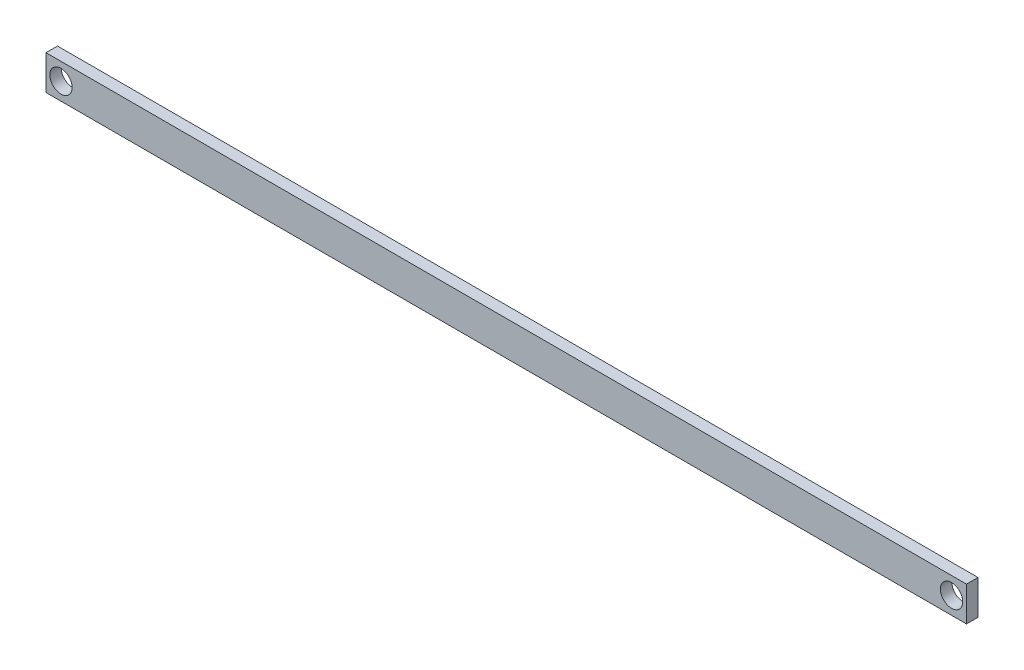
ISO-10303-21;
HEADER;
FILE_DESCRIPTION(('STEP AP214'),'2;1');
FILE_NAME('part.step','',(''),(''),'','','');
FILE_SCHEMA(('AUTOMOTIVE_DESIGN { 1 0 10303 214 1 1 1 1 }'));
ENDSEC;
DATA;
#1=APPLICATION_CONTEXT('core data for automotive mechanical design processes');
#2=APPLICATION_PROTOCOL_DEFINITION('international standard','automotive_design',2000,#1);
#3=PRODUCT_CONTEXT('',#1,'mechanical');
#4=PRODUCT('Part','Part','',(#3));
#5=PRODUCT_RELATED_PRODUCT_CATEGORY('part','',(#4));
#6=PRODUCT_DEFINITION_FORMATION('','',#4);
#7=PRODUCT_DEFINITION_CONTEXT('part definition',#1,'design');
#8=PRODUCT_DEFINITION('design','',#6,#7);
#9=PRODUCT_DEFINITION_SHAPE('','',#8);
#10=(LENGTH_UNIT() NAMED_UNIT(*) SI_UNIT(.MILLI.,.METRE.));
#11=(NAMED_UNIT(*) PLANE_ANGLE_UNIT() SI_UNIT($,.RADIAN.));
#12=(NAMED_UNIT(*) SI_UNIT($,.STERADIAN.) SOLID_ANGLE_UNIT());
#13=UNCERTAINTY_MEASURE_WITH_UNIT(LENGTH_MEASURE(1.E-05),#10,'distance_accuracy_value','');
#14=(GEOMETRIC_REPRESENTATION_CONTEXT(3) GLOBAL_UNCERTAINTY_ASSIGNED_CONTEXT((#13)) GLOBAL_UNIT_ASSIGNED_CONTEXT((#10,
#11,#12)) REPRESENTATION_CONTEXT('',''));
#15=CARTESIAN_POINT('',(0.,0.,0.));
#16=DIRECTION('',(0.,0.,1.));
#17=DIRECTION('',(1.,0.,0.));
#18=AXIS2_PLACEMENT_3D('',#15,#16,#17);
#19=CARTESIAN_POINT('',(0.,0.,-5.));
#20=DIRECTION('',(-1.,0.,0.));
#21=DIRECTION('',(0.,-1.,0.));
#22=AXIS2_PLACEMENT_3D('',#19,#20,#21);
#23=PLANE('',#22);
#24=DIRECTION('',(0.,-1.,0.));
#25=VECTOR('',#24,1.);
#26=CARTESIAN_POINT('',(0.,0.,0.));
#27=LINE('',#26,#25);
#28=CARTESIAN_POINT('',(0.,0.,0.));
#29=VERTEX_POINT('',#28);
#30=CARTESIAN_POINT('',(0.,-15.,0.));
#31=VERTEX_POINT('',#30);
#32=EDGE_CURVE('E117',#29,#31,#27,.T.);
#33=ORIENTED_EDGE('',*,*,#32,.F.);
#34=DIRECTION('',(0.,0.,1.));
#35=VECTOR('',#34,1.);
#36=CARTESIAN_POINT('',(0.,0.,-5.));
#37=LINE('',#36,#35);
#38=CARTESIAN_POINT('',(0.,0.,-5.));
#39=VERTEX_POINT('',#38);
#40=EDGE_CURVE('E11',#39,#29,#37,.T.);
#41=ORIENTED_EDGE('',*,*,#40,.F.);
#42=DIRECTION('',(0.,-1.,0.));
#43=VECTOR('',#42,1.);
#44=CARTESIAN_POINT('',(0.,0.,-5.));
#45=LINE('',#44,#43);
#46=CARTESIAN_POINT('',(0.,-15.,-5.));
#47=VERTEX_POINT('',#46);
#48=EDGE_CURVE('E110',#39,#47,#45,.T.);
#49=ORIENTED_EDGE('',*,*,#48,.T.);
#50=DIRECTION('',(0.,0.,1.));
#51=VECTOR('',#50,1.);
#52=CARTESIAN_POINT('',(0.,-15.,-5.));
#53=LINE('',#52,#51);
#54=EDGE_CURVE('E48',#47,#31,#53,.T.);
#55=ORIENTED_EDGE('',*,*,#54,.T.);
#56=EDGE_LOOP('',(#33,#41,#49,#55));
#57=FACE_BOUND('',#56,.T.);
#58=ADVANCED_FACE('F44',(#57),#23,.T.);
#59=CARTESIAN_POINT('',(0.,0.,-5.));
#60=DIRECTION('',(0.,1.,0.));
#61=DIRECTION('',(0.,0.,1.));
#62=AXIS2_PLACEMENT_3D('',#59,#60,#61);
#63=PLANE('',#62);
#64=DIRECTION('',(-1.,0.,0.));
#65=VECTOR('',#64,1.);
#66=CARTESIAN_POINT('',(0.,0.,0.));
#67=LINE('',#66,#65);
#68=CARTESIAN_POINT('',(400.,0.,0.));
#69=VERTEX_POINT('',#68);
#70=EDGE_CURVE('E106',#69,#29,#67,.T.);
#71=ORIENTED_EDGE('',*,*,#70,.F.);
#72=DIRECTION('',(0.,0.,1.));
#73=VECTOR('',#72,1.);
#74=CARTESIAN_POINT('',(400.,0.,-5.));
#75=LINE('',#74,#73);
#76=CARTESIAN_POINT('',(400.,0.,-5.));
#77=VERTEX_POINT('',#76);
#78=EDGE_CURVE('E54',#77,#69,#75,.T.);
#79=ORIENTED_EDGE('',*,*,#78,.F.);
#80=DIRECTION('',(-1.,0.,0.));
#81=VECTOR('',#80,1.);
#82=CARTESIAN_POINT('',(0.,0.,-5.));
#83=LINE('',#82,#81);
#84=EDGE_CURVE('E105',#77,#39,#83,.T.);
#85=ORIENTED_EDGE('',*,*,#84,.T.);
#86=ORIENTED_EDGE('',*,*,#40,.T.);
#87=EDGE_LOOP('',(#71,#79,#85,#86));
#88=FACE_BOUND('',#87,.T.);
#89=ADVANCED_FACE('F133',(#88),#63,.T.);
#90=CARTESIAN_POINT('',(400.,-15.,-5.));
#91=DIRECTION('',(1.,0.,0.));
#92=DIRECTION('',(0.,0.,-1.));
#93=AXIS2_PLACEMENT_3D('',#90,#91,#92);
#94=PLANE('',#93);
#95=DIRECTION('',(0.,1.,0.));
#96=VECTOR('',#95,1.);
#97=CARTESIAN_POINT('',(400.,-15.,0.));
#98=LINE('',#97,#96);
#99=CARTESIAN_POINT('',(400.,-15.,0.));
#100=VERTEX_POINT('',#99);
#101=EDGE_CURVE('E96',#100,#69,#98,.T.);
#102=ORIENTED_EDGE('',*,*,#101,.F.);
#103=DIRECTION('',(0.,0.,1.));
#104=VECTOR('',#103,1.);
#105=CARTESIAN_POINT('',(400.,-15.,-5.));
#106=LINE('',#105,#104);
#107=CARTESIAN_POINT('',(400.,-15.,-5.));
#108=VERTEX_POINT('',#107);
#109=EDGE_CURVE('E91',#108,#100,#106,.T.);
#110=ORIENTED_EDGE('',*,*,#109,.F.);
#111=DIRECTION('',(0.,1.,0.));
#112=VECTOR('',#111,1.);
#113=CARTESIAN_POINT('',(400.,-15.,-5.));
#114=LINE('',#113,#112);
#115=EDGE_CURVE('E92',#108,#77,#114,.T.);
#116=ORIENTED_EDGE('',*,*,#115,.T.);
#117=ORIENTED_EDGE('',*,*,#78,.T.);
#118=EDGE_LOOP('',(#102,#110,#116,#117));
#119=FACE_BOUND('',#118,.T.);
#120=ADVANCED_FACE('F93',(#119),#94,.T.);
#121=CARTESIAN_POINT('',(0.,-15.,-5.));
#122=DIRECTION('',(0.,-1.,0.));
#123=DIRECTION('',(0.,0.,-1.));
#124=AXIS2_PLACEMENT_3D('',#121,#122,#123);
#125=PLANE('',#124);
#126=DIRECTION('',(1.,0.,0.));
#127=VECTOR('',#126,1.);
#128=CARTESIAN_POINT('',(0.,-15.,0.));
#129=LINE('',#128,#127);
#130=EDGE_CURVE('E116',#31,#100,#129,.T.);
#131=ORIENTED_EDGE('',*,*,#130,.F.);
#132=ORIENTED_EDGE('',*,*,#54,.F.);
#133=DIRECTION('',(1.,0.,0.));
#134=VECTOR('',#133,1.);
#135=CARTESIAN_POINT('',(0.,-15.,-5.));
#136=LINE('',#135,#134);
#137=EDGE_CURVE('E102',#47,#108,#136,.T.);
#138=ORIENTED_EDGE('',*,*,#137,.T.);
#139=ORIENTED_EDGE('',*,*,#109,.T.);
#140=EDGE_LOOP('',(#131,#132,#138,#139));
#141=FACE_BOUND('',#140,.T.);
#142=ADVANCED_FACE('F103',(#141),#125,.T.);
#143=CARTESIAN_POINT('',(0.,0.,-5.));
#144=DIRECTION('',(0.,0.,1.));
#145=DIRECTION('',(1.,0.,0.));
#146=AXIS2_PLACEMENT_3D('',#143,#144,#145);
#147=PLANE('',#146);
#148=CARTESIAN_POINT('',(6.5,-7.5,-5.));
#149=DIRECTION('',(0.,0.,1.));
#150=DIRECTION('',(1.,0.,0.));
#151=AXIS2_PLACEMENT_3D('',#148,#149,#150);
#152=CIRCLE('',#151,4.85);
#153=CARTESIAN_POINT('',(11.35,-7.5,-5.));
#154=VERTEX_POINT('',#153);
#155=EDGE_CURVE('E123',#154,#154,#152,.T.);
#156=ORIENTED_EDGE('',*,*,#155,.T.);
#157=EDGE_LOOP('',(#156));
#158=FACE_BOUND('',#157,.T.);
#159=CARTESIAN_POINT('',(393.5,-7.5,-5.));
#160=DIRECTION('',(0.,0.,1.));
#161=DIRECTION('',(1.,0.,0.));
#162=AXIS2_PLACEMENT_3D('',#159,#160,#161);
#163=CIRCLE('',#162,4.85000000000003);
#164=CARTESIAN_POINT('',(398.35,-7.5,-5.));
#165=VERTEX_POINT('',#164);
#166=EDGE_CURVE('E176',#165,#165,#163,.T.);
#167=ORIENTED_EDGE('',*,*,#166,.T.);
#168=EDGE_LOOP('',(#167));
#169=FACE_BOUND('',#168,.T.);
#170=ORIENTED_EDGE('',*,*,#48,.F.);
#171=ORIENTED_EDGE('',*,*,#84,.F.);
#172=ORIENTED_EDGE('',*,*,#115,.F.);
#173=ORIENTED_EDGE('',*,*,#137,.F.);
#174=EDGE_LOOP('',(#170,#171,#172,#173));
#175=FACE_BOUND('',#174,.T.);
#176=ADVANCED_FACE('F99',(#158,#169,#175),#147,.F.);
#177=CARTESIAN_POINT('',(0.,0.,0.));
#178=DIRECTION('',(0.,0.,1.));
#179=DIRECTION('',(1.,0.,0.));
#180=AXIS2_PLACEMENT_3D('',#177,#178,#179);
#181=PLANE('',#180);
#182=CARTESIAN_POINT('',(6.5,-7.5,0.));
#183=DIRECTION('',(0.,0.,1.));
#184=DIRECTION('',(1.,0.,0.));
#185=AXIS2_PLACEMENT_3D('',#182,#183,#184);
#186=CIRCLE('',#185,4.85);
#187=CARTESIAN_POINT('',(11.35,-7.5,0.));
#188=VERTEX_POINT('',#187);
#189=EDGE_CURVE('E166',#188,#188,#186,.T.);
#190=ORIENTED_EDGE('',*,*,#189,.F.);
#191=EDGE_LOOP('',(#190));
#192=FACE_BOUND('',#191,.T.);
#193=CARTESIAN_POINT('',(393.5,-7.5,0.));
#194=DIRECTION('',(0.,0.,1.));
#195=DIRECTION('',(1.,0.,0.));
#196=AXIS2_PLACEMENT_3D('',#193,#194,#195);
#197=CIRCLE('',#196,4.85000000000003);
#198=CARTESIAN_POINT('',(398.35,-7.5,0.));
#199=VERTEX_POINT('',#198);
#200=EDGE_CURVE('E169',#199,#199,#197,.T.);
#201=ORIENTED_EDGE('',*,*,#200,.F.);
#202=EDGE_LOOP('',(#201));
#203=FACE_BOUND('',#202,.T.);
#204=ORIENTED_EDGE('',*,*,#32,.T.);
#205=ORIENTED_EDGE('',*,*,#130,.T.);
#206=ORIENTED_EDGE('',*,*,#101,.T.);
#207=ORIENTED_EDGE('',*,*,#70,.T.);
#208=EDGE_LOOP('',(#204,#205,#206,#207));
#209=FACE_BOUND('',#208,.T.);
#210=ADVANCED_FACE('F135',(#192,#203,#209),#181,.T.);
#211=CARTESIAN_POINT('',(393.5,-7.5,-5.));
#212=DIRECTION('',(0.,0.,1.));
#213=DIRECTION('',(1.,0.,0.));
#214=AXIS2_PLACEMENT_3D('',#211,#212,#213);
#215=CYLINDRICAL_SURFACE('',#214,4.85000000000003);
#216=ORIENTED_EDGE('',*,*,#166,.F.);
#217=EDGE_LOOP('',(#216));
#218=FACE_BOUND('',#217,.T.);
#219=ORIENTED_EDGE('',*,*,#200,.T.);
#220=EDGE_LOOP('',(#219));
#221=FACE_BOUND('',#220,.T.);
#222=ADVANCED_FACE('F152',(#218,#221),#215,.F.);
#223=CARTESIAN_POINT('',(6.5,-7.5,-5.));
#224=DIRECTION('',(0.,0.,1.));
#225=DIRECTION('',(1.,0.,0.));
#226=AXIS2_PLACEMENT_3D('',#223,#224,#225);
#227=CYLINDRICAL_SURFACE('',#226,4.85);
#228=ORIENTED_EDGE('',*,*,#155,.F.);
#229=EDGE_LOOP('',(#228));
#230=FACE_BOUND('',#229,.T.);
#231=ORIENTED_EDGE('',*,*,#189,.T.);
#232=EDGE_LOOP('',(#231));
#233=FACE_BOUND('',#232,.T.);
#234=ADVANCED_FACE('F156',(#230,#233),#227,.F.);
#235=CLOSED_SHELL('',(#58,#89,#120,#142,#176,#210,#222,#234));
#236=MANIFOLD_SOLID_BREP('B2',#235);
#237=ADVANCED_BREP_SHAPE_REPRESENTATION('',(#18,#236),#14);
#238=SHAPE_DEFINITION_REPRESENTATION(#9,#237);
ENDSEC;
END-ISO-10303-21;
